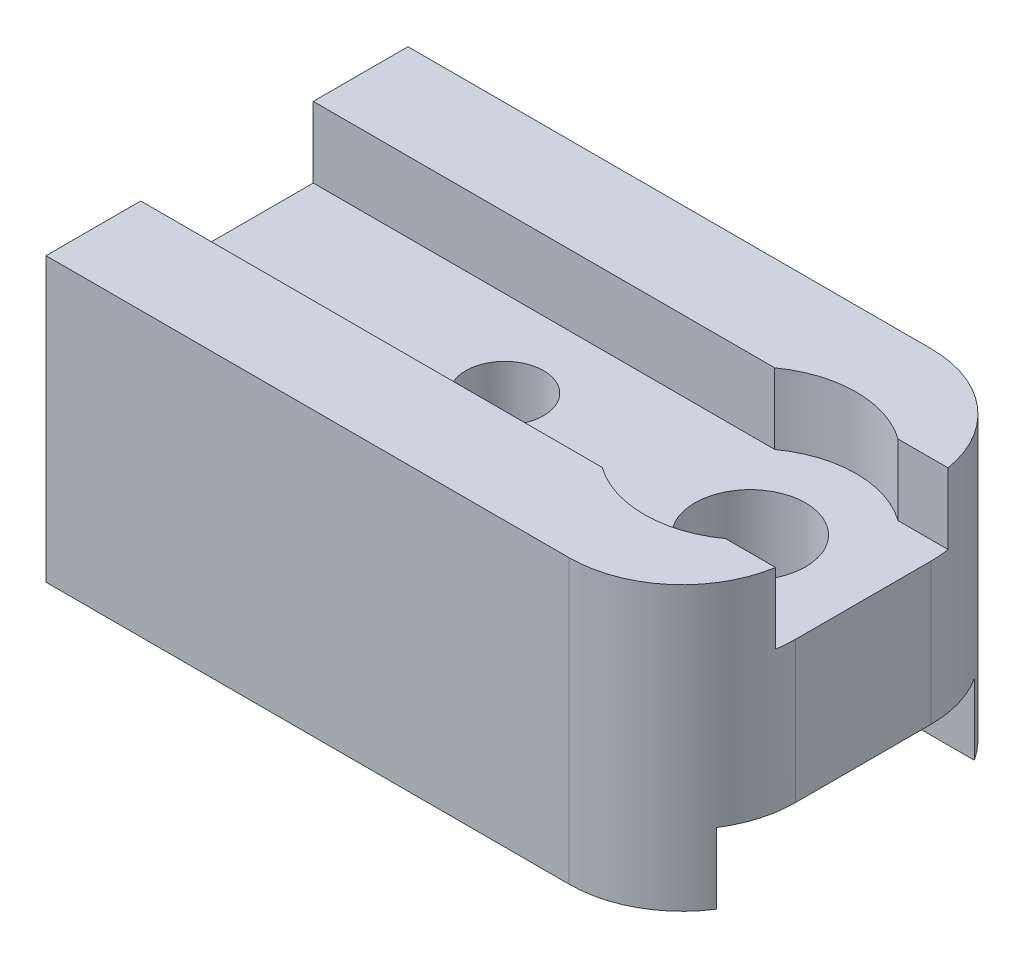
ISO-10303-21;
HEADER;
FILE_DESCRIPTION(('STEP AP214'),'2;1');
FILE_NAME('part.step','',(''),(''),'','','');
FILE_SCHEMA(('AUTOMOTIVE_DESIGN { 1 0 10303 214 1 1 1 1 }'));
ENDSEC;
DATA;
#1=APPLICATION_CONTEXT('core data for automotive mechanical design processes');
#2=APPLICATION_PROTOCOL_DEFINITION('international standard','automotive_design',2000,#1);
#3=PRODUCT_CONTEXT('',#1,'mechanical');
#4=PRODUCT('Part','Part','',(#3));
#5=PRODUCT_RELATED_PRODUCT_CATEGORY('part','',(#4));
#6=PRODUCT_DEFINITION_FORMATION('','',#4);
#7=PRODUCT_DEFINITION_CONTEXT('part definition',#1,'design');
#8=PRODUCT_DEFINITION('design','',#6,#7);
#9=PRODUCT_DEFINITION_SHAPE('','',#8);
#10=(LENGTH_UNIT() NAMED_UNIT(*) SI_UNIT(.MILLI.,.METRE.));
#11=(NAMED_UNIT(*) PLANE_ANGLE_UNIT() SI_UNIT($,.RADIAN.));
#12=(NAMED_UNIT(*) SI_UNIT($,.STERADIAN.) SOLID_ANGLE_UNIT());
#13=UNCERTAINTY_MEASURE_WITH_UNIT(LENGTH_MEASURE(1.E-05),#10,'distance_accuracy_value','');
#14=(GEOMETRIC_REPRESENTATION_CONTEXT(3) GLOBAL_UNCERTAINTY_ASSIGNED_CONTEXT((#13)) GLOBAL_UNIT_ASSIGNED_CONTEXT((#10,
#11,#12)) REPRESENTATION_CONTEXT('',''));
#15=CARTESIAN_POINT('',(0.,0.,0.));
#16=DIRECTION('',(0.,0.,1.));
#17=DIRECTION('',(1.,0.,0.));
#18=AXIS2_PLACEMENT_3D('',#15,#16,#17);
#19=CARTESIAN_POINT('',(-2.41594633531577,9.525,-12.0015));
#20=DIRECTION('',(0.,0.,-1.));
#21=DIRECTION('',(-1.,0.,0.));
#22=AXIS2_PLACEMENT_3D('',#19,#20,#21);
#23=PLANE('',#22);
#24=DIRECTION('',(0.,-1.,0.));
#25=VECTOR('',#24,1.);
#26=CARTESIAN_POINT('',(26.2658128771175,12.7,-12.0015));
#27=LINE('',#26,#25);
#28=CARTESIAN_POINT('',(26.2658128771175,9.525,-12.0015));
#29=VERTEX_POINT('',#28);
#30=CARTESIAN_POINT('',(26.2658128771175,12.7,-12.0015));
#31=VERTEX_POINT('',#30);
#32=EDGE_CURVE('E302',#29,#31,#27,.F.);
#33=ORIENTED_EDGE('',*,*,#32,.F.);
#34=DIRECTION('',(-1.,0.,0.));
#35=VECTOR('',#34,1.);
#36=CARTESIAN_POINT('',(-2.41594633531577,9.525,-12.0015));
#37=LINE('',#36,#35);
#38=CARTESIAN_POINT('',(28.5074794014539,9.525,-12.0015));
#39=VERTEX_POINT('',#38);
#40=EDGE_CURVE('E191',#39,#29,#37,.T.);
#41=ORIENTED_EDGE('',*,*,#40,.F.);
#42=DIRECTION('',(0.,-1.,0.));
#43=VECTOR('',#42,1.);
#44=CARTESIAN_POINT('',(28.5074794014539,9.525,-12.0015));
#45=LINE('',#44,#43);
#46=CARTESIAN_POINT('',(28.5074794014539,12.7,-12.0015));
#47=VERTEX_POINT('',#46);
#48=EDGE_CURVE('E264',#39,#47,#45,.F.);
#49=ORIENTED_EDGE('',*,*,#48,.T.);
#50=DIRECTION('',(-1.,0.,0.));
#51=VECTOR('',#50,1.);
#52=CARTESIAN_POINT('',(-2.41594633531577,12.7,-12.0015));
#53=LINE('',#52,#51);
#54=EDGE_CURVE('E193',#47,#31,#53,.T.);
#55=ORIENTED_EDGE('',*,*,#54,.T.);
#56=EDGE_LOOP('',(#33,#41,#49,#55));
#57=FACE_BOUND('',#56,.T.);
#58=ADVANCED_FACE('F36',(#57),#23,.F.);
#59=DIRECTION('',(0.,-1.,0.));
#60=VECTOR('',#59,1.);
#61=CARTESIAN_POINT('',(20.7241871228825,12.7,-12.0015));
#62=LINE('',#61,#60);
#63=CARTESIAN_POINT('',(20.7241871228825,12.7,-12.0015));
#64=VERTEX_POINT('',#63);
#65=CARTESIAN_POINT('',(20.7241871228825,9.525,-12.0015));
#66=VERTEX_POINT('',#65);
#67=EDGE_CURVE('E331',#64,#66,#62,.T.);
#68=ORIENTED_EDGE('',*,*,#67,.F.);
#69=CARTESIAN_POINT('',(0.,12.7,-12.0015));
#70=VERTEX_POINT('',#69);
#71=EDGE_CURVE('E185',#64,#70,#53,.T.);
#72=ORIENTED_EDGE('',*,*,#71,.T.);
#73=DIRECTION('',(0.,1.,0.));
#74=VECTOR('',#73,1.);
#75=CARTESIAN_POINT('',(0.,12.7,-12.0015));
#76=LINE('',#75,#74);
#77=CARTESIAN_POINT('',(0.,9.525,-12.0015));
#78=VERTEX_POINT('',#77);
#79=EDGE_CURVE('E208',#78,#70,#76,.T.);
#80=ORIENTED_EDGE('',*,*,#79,.F.);
#81=EDGE_CURVE('E303',#66,#78,#37,.T.);
#82=ORIENTED_EDGE('',*,*,#81,.F.);
#83=EDGE_LOOP('',(#68,#72,#80,#82));
#84=FACE_BOUND('',#83,.T.);
#85=ADVANCED_FACE('F340',(#84),#23,.F.);
#86=CARTESIAN_POINT('',(-2.41594633531577,9.525,-4.2545));
#87=DIRECTION('',(0.,0.,1.));
#88=DIRECTION('',(1.,0.,0.));
#89=AXIS2_PLACEMENT_3D('',#86,#87,#88);
#90=PLANE('',#89);
#91=DIRECTION('',(0.,-1.,0.));
#92=VECTOR('',#91,1.);
#93=CARTESIAN_POINT('',(20.7241871228825,12.7,-4.2545));
#94=LINE('',#93,#92);
#95=CARTESIAN_POINT('',(20.7241871228825,9.525,-4.2545));
#96=VERTEX_POINT('',#95);
#97=CARTESIAN_POINT('',(20.7241871228825,12.7,-4.2545));
#98=VERTEX_POINT('',#97);
#99=EDGE_CURVE('E165',#96,#98,#94,.F.);
#100=ORIENTED_EDGE('',*,*,#99,.F.);
#101=DIRECTION('',(1.,0.,0.));
#102=VECTOR('',#101,1.);
#103=CARTESIAN_POINT('',(-2.41594633531577,9.525,-4.2545));
#104=LINE('',#103,#102);
#105=CARTESIAN_POINT('',(0.,9.525,-4.2545));
#106=VERTEX_POINT('',#105);
#107=EDGE_CURVE('E304',#106,#96,#104,.T.);
#108=ORIENTED_EDGE('',*,*,#107,.F.);
#109=DIRECTION('',(0.,-1.,0.));
#110=VECTOR('',#109,1.);
#111=CARTESIAN_POINT('',(0.,12.7,-4.2545));
#112=LINE('',#111,#110);
#113=CARTESIAN_POINT('',(0.,12.7,-4.2545));
#114=VERTEX_POINT('',#113);
#115=EDGE_CURVE('E205',#114,#106,#112,.T.);
#116=ORIENTED_EDGE('',*,*,#115,.F.);
#117=DIRECTION('',(1.,0.,0.));
#118=VECTOR('',#117,1.);
#119=CARTESIAN_POINT('',(-2.41594633531577,12.7,-4.2545));
#120=LINE('',#119,#118);
#121=EDGE_CURVE('E182',#114,#98,#120,.T.);
#122=ORIENTED_EDGE('',*,*,#121,.T.);
#123=EDGE_LOOP('',(#100,#108,#116,#122));
#124=FACE_BOUND('',#123,.T.);
#125=ADVANCED_FACE('F347',(#124),#90,.F.);
#126=DIRECTION('',(0.,-1.,0.));
#127=VECTOR('',#126,1.);
#128=CARTESIAN_POINT('',(26.2658128771175,12.7,-4.2545));
#129=LINE('',#128,#127);
#130=CARTESIAN_POINT('',(26.2658128771175,12.7,-4.2545));
#131=VERTEX_POINT('',#130);
#132=CARTESIAN_POINT('',(26.2658128771175,9.525,-4.2545));
#133=VERTEX_POINT('',#132);
#134=EDGE_CURVE('E162',#131,#133,#129,.T.);
#135=ORIENTED_EDGE('',*,*,#134,.F.);
#136=CARTESIAN_POINT('',(28.5074794014539,12.7,-4.2545));
#137=VERTEX_POINT('',#136);
#138=EDGE_CURVE('E174',#131,#137,#120,.T.);
#139=ORIENTED_EDGE('',*,*,#138,.T.);
#140=DIRECTION('',(0.,-1.,0.));
#141=VECTOR('',#140,1.);
#142=CARTESIAN_POINT('',(28.5074794014539,12.7,-4.2545));
#143=LINE('',#142,#141);
#144=CARTESIAN_POINT('',(28.5074794014539,9.525,-4.2545));
#145=VERTEX_POINT('',#144);
#146=EDGE_CURVE('E11',#137,#145,#143,.T.);
#147=ORIENTED_EDGE('',*,*,#146,.T.);
#148=EDGE_CURVE('E176',#133,#145,#104,.T.);
#149=ORIENTED_EDGE('',*,*,#148,.F.);
#150=EDGE_LOOP('',(#135,#139,#147,#149));
#151=FACE_BOUND('',#150,.T.);
#152=ADVANCED_FACE('F173',(#151),#90,.F.);
#153=CARTESIAN_POINT('',(12.4714,12.7,-8.128));
#154=DIRECTION('',(0.,-1.,0.));
#155=DIRECTION('',(0.,0.,-1.));
#156=AXIS2_PLACEMENT_3D('',#153,#154,#155);
#157=CYLINDRICAL_SURFACE('',#156,1.75);
#158=CARTESIAN_POINT('',(12.4714,9.525,-8.128));
#159=DIRECTION('',(0.,1.,0.));
#160=DIRECTION('',(0.,0.,1.));
#161=AXIS2_PLACEMENT_3D('',#158,#159,#160);
#162=CIRCLE('',#161,1.75);
#163=CARTESIAN_POINT('',(12.4714,9.525,-6.378));
#164=VERTEX_POINT('',#163);
#165=EDGE_CURVE('E200',#164,#164,#162,.T.);
#166=ORIENTED_EDGE('',*,*,#165,.T.);
#167=EDGE_LOOP('',(#166));
#168=FACE_BOUND('',#167,.T.);
#169=CARTESIAN_POINT('',(12.4714,6.8072,-8.128));
#170=DIRECTION('',(0.,-1.,0.));
#171=DIRECTION('',(0.,0.,-1.));
#172=AXIS2_PLACEMENT_3D('',#169,#170,#171);
#173=CIRCLE('',#172,1.75);
#174=CARTESIAN_POINT('',(12.4714,6.8072,-9.878));
#175=VERTEX_POINT('',#174);
#176=EDGE_CURVE('E240',#175,#175,#173,.T.);
#177=ORIENTED_EDGE('',*,*,#176,.T.);
#178=EDGE_LOOP('',(#177));
#179=FACE_BOUND('',#178,.T.);
#180=ADVANCED_FACE('F393',(#168,#179),#157,.F.);
#181=CARTESIAN_POINT('',(23.495,12.7,-8.128));
#182=DIRECTION('',(0.,-1.,0.));
#183=DIRECTION('',(0.,0.,-1.));
#184=AXIS2_PLACEMENT_3D('',#181,#182,#183);
#185=CYLINDRICAL_SURFACE('',#184,2.4892);
#186=CARTESIAN_POINT('',(23.495,9.525,-8.128));
#187=DIRECTION('',(0.,1.,0.));
#188=DIRECTION('',(0.,0.,1.));
#189=AXIS2_PLACEMENT_3D('',#186,#187,#188);
#190=CIRCLE('',#189,2.4892);
#191=CARTESIAN_POINT('',(23.495,9.525,-5.6388));
#192=VERTEX_POINT('',#191);
#193=EDGE_CURVE('E196',#192,#192,#190,.T.);
#194=ORIENTED_EDGE('',*,*,#193,.T.);
#195=EDGE_LOOP('',(#194));
#196=FACE_BOUND('',#195,.T.);
#197=CARTESIAN_POINT('',(23.495,3.175,-8.128));
#198=DIRECTION('',(0.,-1.,0.));
#199=DIRECTION('',(0.,0.,-1.));
#200=AXIS2_PLACEMENT_3D('',#197,#198,#199);
#201=CIRCLE('',#200,2.4892);
#202=CARTESIAN_POINT('',(23.495,3.175,-10.6172));
#203=VERTEX_POINT('',#202);
#204=EDGE_CURVE('E311',#203,#203,#201,.T.);
#205=ORIENTED_EDGE('',*,*,#204,.T.);
#206=EDGE_LOOP('',(#205));
#207=FACE_BOUND('',#206,.T.);
#208=ADVANCED_FACE('F380',(#196,#207),#185,.F.);
#209=CARTESIAN_POINT('',(0.,0.,0.));
#210=DIRECTION('',(0.,-1.,0.));
#211=DIRECTION('',(0.,0.,-1.));
#212=AXIS2_PLACEMENT_3D('',#209,#210,#211);
#213=PLANE('',#212);
#214=DIRECTION('',(-1.,0.,0.));
#215=VECTOR('',#214,1.);
#216=CARTESIAN_POINT('',(-1.06671810131204,0.,-2.3368));
#217=LINE('',#216,#215);
#218=CARTESIAN_POINT('',(27.7706582838202,0.,-2.3368));
#219=VERTEX_POINT('',#218);
#220=CARTESIAN_POINT('',(0.,0.,-2.3368));
#221=VERTEX_POINT('',#220);
#222=EDGE_CURVE('E317',#219,#221,#217,.T.);
#223=ORIENTED_EDGE('',*,*,#222,.F.);
#224=CARTESIAN_POINT('',(23.495,0.,-5.08));
#225=DIRECTION('',(0.,-1.,0.));
#226=DIRECTION('',(0.,0.,-1.));
#227=AXIS2_PLACEMENT_3D('',#224,#225,#226);
#228=CIRCLE('',#227,5.08);
#229=CARTESIAN_POINT('',(23.495,0.,0.));
#230=VERTEX_POINT('',#229);
#231=EDGE_CURVE('E270',#219,#230,#228,.T.);
#232=ORIENTED_EDGE('',*,*,#231,.T.);
#233=DIRECTION('',(1.,0.,0.));
#234=VECTOR('',#233,1.);
#235=CARTESIAN_POINT('',(0.,0.,0.));
#236=LINE('',#235,#234);
#237=CARTESIAN_POINT('',(0.,0.,0.));
#238=VERTEX_POINT('',#237);
#239=EDGE_CURVE('E224',#238,#230,#236,.T.);
#240=ORIENTED_EDGE('',*,*,#239,.F.);
#241=DIRECTION('',(0.,0.,1.));
#242=VECTOR('',#241,1.);
#243=CARTESIAN_POINT('',(0.,0.,0.));
#244=LINE('',#243,#242);
#245=EDGE_CURVE('E211',#221,#238,#244,.T.);
#246=ORIENTED_EDGE('',*,*,#245,.F.);
#247=EDGE_LOOP('',(#223,#232,#240,#246));
#248=FACE_BOUND('',#247,.T.);
#249=ADVANCED_FACE('F352',(#248),#213,.T.);
#250=CARTESIAN_POINT('',(0.,12.7,0.));
#251=DIRECTION('',(0.,-1.,0.));
#252=DIRECTION('',(0.,0.,-1.));
#253=AXIS2_PLACEMENT_3D('',#250,#251,#252);
#254=PLANE('',#253);
#255=CARTESIAN_POINT('',(23.495,12.7,-8.128));
#256=DIRECTION('',(0.,1.,0.));
#257=DIRECTION('',(0.,0.,1.));
#258=AXIS2_PLACEMENT_3D('',#255,#256,#257);
#259=CIRCLE('',#258,4.7625);
#260=EDGE_CURVE('E170',#31,#64,#259,.T.);
#261=ORIENTED_EDGE('',*,*,#260,.F.);
#262=ORIENTED_EDGE('',*,*,#54,.F.);
#263=CARTESIAN_POINT('',(23.495,12.7,-11.176));
#264=DIRECTION('',(0.,-1.,0.));
#265=DIRECTION('',(0.,0.,-1.));
#266=AXIS2_PLACEMENT_3D('',#263,#264,#265);
#267=CIRCLE('',#266,5.08);
#268=CARTESIAN_POINT('',(23.495,12.7,-16.256));
#269=VERTEX_POINT('',#268);
#270=EDGE_CURVE('E266',#47,#269,#267,.F.);
#271=ORIENTED_EDGE('',*,*,#270,.T.);
#272=DIRECTION('',(-1.,0.,0.));
#273=VECTOR('',#272,1.);
#274=CARTESIAN_POINT('',(0.,12.7,-16.256));
#275=LINE('',#274,#273);
#276=CARTESIAN_POINT('',(0.,12.7,-16.256));
#277=VERTEX_POINT('',#276);
#278=EDGE_CURVE('E218',#269,#277,#275,.T.);
#279=ORIENTED_EDGE('',*,*,#278,.T.);
#280=DIRECTION('',(0.,0.,1.));
#281=VECTOR('',#280,1.);
#282=CARTESIAN_POINT('',(0.,12.7,0.));
#283=LINE('',#282,#281);
#284=EDGE_CURVE('E212',#277,#70,#283,.T.);
#285=ORIENTED_EDGE('',*,*,#284,.T.);
#286=ORIENTED_EDGE('',*,*,#71,.F.);
#287=EDGE_LOOP('',(#261,#262,#271,#279,#285,#286));
#288=FACE_BOUND('',#287,.T.);
#289=ADVANCED_FACE('F373',(#288),#254,.F.);
#290=EDGE_CURVE('E159',#98,#131,#259,.T.);
#291=ORIENTED_EDGE('',*,*,#290,.F.);
#292=ORIENTED_EDGE('',*,*,#121,.F.);
#293=CARTESIAN_POINT('',(0.,12.7,0.));
#294=VERTEX_POINT('',#293);
#295=EDGE_CURVE('E216',#114,#294,#283,.T.);
#296=ORIENTED_EDGE('',*,*,#295,.T.);
#297=DIRECTION('',(1.,0.,0.));
#298=VECTOR('',#297,1.);
#299=CARTESIAN_POINT('',(0.,12.7,0.));
#300=LINE('',#299,#298);
#301=CARTESIAN_POINT('',(23.495,12.7,0.));
#302=VERTEX_POINT('',#301);
#303=EDGE_CURVE('E215',#294,#302,#300,.T.);
#304=ORIENTED_EDGE('',*,*,#303,.T.);
#305=CARTESIAN_POINT('',(23.495,12.7,-5.08));
#306=DIRECTION('',(0.,-1.,0.));
#307=DIRECTION('',(0.,0.,-1.));
#308=AXIS2_PLACEMENT_3D('',#305,#306,#307);
#309=CIRCLE('',#308,5.08);
#310=EDGE_CURVE('E44',#302,#137,#309,.F.);
#311=ORIENTED_EDGE('',*,*,#310,.T.);
#312=ORIENTED_EDGE('',*,*,#138,.F.);
#313=EDGE_LOOP('',(#291,#292,#296,#304,#311,#312));
#314=FACE_BOUND('',#313,.T.);
#315=ADVANCED_FACE('F178',(#314),#254,.F.);
#316=DIRECTION('',(-1.,0.,0.));
#317=VECTOR('',#316,1.);
#318=CARTESIAN_POINT('',(0.,0.,-16.256));
#319=LINE('',#318,#317);
#320=CARTESIAN_POINT('',(23.495,0.,-16.256));
#321=VERTEX_POINT('',#320);
#322=CARTESIAN_POINT('',(0.,0.,-16.256));
#323=VERTEX_POINT('',#322);
#324=EDGE_CURVE('E227',#321,#323,#319,.T.);
#325=ORIENTED_EDGE('',*,*,#324,.F.);
#326=CARTESIAN_POINT('',(23.495,0.,-11.176));
#327=DIRECTION('',(0.,-1.,0.));
#328=DIRECTION('',(0.,0.,-1.));
#329=AXIS2_PLACEMENT_3D('',#326,#327,#328);
#330=CIRCLE('',#329,5.08);
#331=CARTESIAN_POINT('',(27.7706582838202,0.,-13.9192));
#332=VERTEX_POINT('',#331);
#333=EDGE_CURVE('E247',#321,#332,#330,.T.);
#334=ORIENTED_EDGE('',*,*,#333,.T.);
#335=DIRECTION('',(1.,0.,0.));
#336=VECTOR('',#335,1.);
#337=CARTESIAN_POINT('',(-1.06671810131204,0.,-13.9192));
#338=LINE('',#337,#336);
#339=CARTESIAN_POINT('',(0.,0.,-13.9192));
#340=VERTEX_POINT('',#339);
#341=EDGE_CURVE('E243',#340,#332,#338,.T.);
#342=ORIENTED_EDGE('',*,*,#341,.F.);
#343=EDGE_CURVE('E221',#323,#340,#244,.T.);
#344=ORIENTED_EDGE('',*,*,#343,.F.);
#345=EDGE_LOOP('',(#325,#334,#342,#344));
#346=FACE_BOUND('',#345,.T.);
#347=ADVANCED_FACE('F367',(#346),#213,.T.);
#348=CARTESIAN_POINT('',(0.,12.7,0.));
#349=DIRECTION('',(1.,0.,0.));
#350=DIRECTION('',(0.,0.,-1.));
#351=AXIS2_PLACEMENT_3D('',#348,#349,#350);
#352=PLANE('',#351);
#353=DIRECTION('',(0.,0.,-1.));
#354=VECTOR('',#353,1.);
#355=CARTESIAN_POINT('',(0.,3.175,0.));
#356=LINE('',#355,#354);
#357=CARTESIAN_POINT('',(0.,3.175,-2.3368));
#358=VERTEX_POINT('',#357);
#359=CARTESIAN_POINT('',(0.,3.175,-13.9192));
#360=VERTEX_POINT('',#359);
#361=EDGE_CURVE('E314',#358,#360,#356,.T.);
#362=ORIENTED_EDGE('',*,*,#361,.F.);
#363=DIRECTION('',(0.,-1.,0.));
#364=VECTOR('',#363,1.);
#365=CARTESIAN_POINT('',(0.,12.7,-2.3368));
#366=LINE('',#365,#364);
#367=EDGE_CURVE('E183',#358,#221,#366,.T.);
#368=ORIENTED_EDGE('',*,*,#367,.T.);
#369=ORIENTED_EDGE('',*,*,#245,.T.);
#370=DIRECTION('',(0.,-1.,0.));
#371=VECTOR('',#370,1.);
#372=CARTESIAN_POINT('',(0.,12.7,0.));
#373=LINE('',#372,#371);
#374=EDGE_CURVE('E231',#294,#238,#373,.T.);
#375=ORIENTED_EDGE('',*,*,#374,.F.);
#376=ORIENTED_EDGE('',*,*,#295,.F.);
#377=ORIENTED_EDGE('',*,*,#115,.T.);
#378=DIRECTION('',(0.,0.,1.));
#379=VECTOR('',#378,1.);
#380=CARTESIAN_POINT('',(0.,9.525,0.));
#381=LINE('',#380,#379);
#382=EDGE_CURVE('E203',#78,#106,#381,.T.);
#383=ORIENTED_EDGE('',*,*,#382,.F.);
#384=ORIENTED_EDGE('',*,*,#79,.T.);
#385=ORIENTED_EDGE('',*,*,#284,.F.);
#386=DIRECTION('',(0.,-1.,0.));
#387=VECTOR('',#386,1.);
#388=CARTESIAN_POINT('',(0.,12.7,-16.256));
#389=LINE('',#388,#387);
#390=EDGE_CURVE('E220',#277,#323,#389,.T.);
#391=ORIENTED_EDGE('',*,*,#390,.T.);
#392=ORIENTED_EDGE('',*,*,#343,.T.);
#393=DIRECTION('',(0.,1.,0.));
#394=VECTOR('',#393,1.);
#395=CARTESIAN_POINT('',(0.,12.7,-13.9192));
#396=LINE('',#395,#394);
#397=EDGE_CURVE('E187',#340,#360,#396,.T.);
#398=ORIENTED_EDGE('',*,*,#397,.T.);
#399=EDGE_LOOP('',(#362,#368,#369,#375,#376,#377,#383,#384,#385,#391,#392,#398));
#400=FACE_BOUND('',#399,.T.);
#401=ADVANCED_FACE('F345',(#400),#352,.F.);
#402=CARTESIAN_POINT('',(0.,12.7,0.));
#403=DIRECTION('',(0.,0.,-1.));
#404=DIRECTION('',(-1.,0.,0.));
#405=AXIS2_PLACEMENT_3D('',#402,#403,#404);
#406=PLANE('',#405);
#407=ORIENTED_EDGE('',*,*,#239,.T.);
#408=DIRECTION('',(0.,-1.,0.));
#409=VECTOR('',#408,1.);
#410=CARTESIAN_POINT('',(23.495,12.7,0.));
#411=LINE('',#410,#409);
#412=EDGE_CURVE('E272',#230,#302,#411,.F.);
#413=ORIENTED_EDGE('',*,*,#412,.T.);
#414=ORIENTED_EDGE('',*,*,#303,.F.);
#415=ORIENTED_EDGE('',*,*,#374,.T.);
#416=EDGE_LOOP('',(#407,#413,#414,#415));
#417=FACE_BOUND('',#416,.T.);
#418=ADVANCED_FACE('F276',(#417),#406,.F.);
#419=CARTESIAN_POINT('',(28.575,12.7,0.));
#420=DIRECTION('',(-1.,0.,0.));
#421=DIRECTION('',(0.,0.,1.));
#422=AXIS2_PLACEMENT_3D('',#419,#420,#421);
#423=PLANE('',#422);
#424=DIRECTION('',(0.,0.,1.));
#425=VECTOR('',#424,1.);
#426=CARTESIAN_POINT('',(28.575,3.175,0.));
#427=LINE('',#426,#425);
#428=CARTESIAN_POINT('',(28.575,3.175,-11.176));
#429=VERTEX_POINT('',#428);
#430=CARTESIAN_POINT('',(28.575,3.175,-5.08));
#431=VERTEX_POINT('',#430);
#432=EDGE_CURVE('E234',#429,#431,#427,.T.);
#433=ORIENTED_EDGE('',*,*,#432,.F.);
#434=DIRECTION('',(0.,-1.,0.));
#435=VECTOR('',#434,1.);
#436=CARTESIAN_POINT('',(28.575,12.7,-11.176));
#437=LINE('',#436,#435);
#438=CARTESIAN_POINT('',(28.575,9.525,-11.176));
#439=VERTEX_POINT('',#438);
#440=EDGE_CURVE('E258',#429,#439,#437,.F.);
#441=ORIENTED_EDGE('',*,*,#440,.T.);
#442=DIRECTION('',(0.,0.,-1.));
#443=VECTOR('',#442,1.);
#444=CARTESIAN_POINT('',(28.575,9.525,0.));
#445=LINE('',#444,#443);
#446=CARTESIAN_POINT('',(28.575,9.525,-5.08));
#447=VERTEX_POINT('',#446);
#448=EDGE_CURVE('E199',#447,#439,#445,.T.);
#449=ORIENTED_EDGE('',*,*,#448,.F.);
#450=DIRECTION('',(0.,-1.,0.));
#451=VECTOR('',#450,1.);
#452=CARTESIAN_POINT('',(28.575,12.7,-5.08));
#453=LINE('',#452,#451);
#454=EDGE_CURVE('E255',#447,#431,#453,.T.);
#455=ORIENTED_EDGE('',*,*,#454,.T.);
#456=EDGE_LOOP('',(#433,#441,#449,#455));
#457=FACE_BOUND('',#456,.T.);
#458=ADVANCED_FACE('F290',(#457),#423,.F.);
#459=CARTESIAN_POINT('',(0.,12.7,-16.256));
#460=DIRECTION('',(0.,0.,1.));
#461=DIRECTION('',(1.,0.,0.));
#462=AXIS2_PLACEMENT_3D('',#459,#460,#461);
#463=PLANE('',#462);
#464=ORIENTED_EDGE('',*,*,#278,.F.);
#465=DIRECTION('',(0.,-1.,0.));
#466=VECTOR('',#465,1.);
#467=CARTESIAN_POINT('',(23.495,12.7,-16.256));
#468=LINE('',#467,#466);
#469=EDGE_CURVE('E239',#269,#321,#468,.T.);
#470=ORIENTED_EDGE('',*,*,#469,.T.);
#471=ORIENTED_EDGE('',*,*,#324,.T.);
#472=ORIENTED_EDGE('',*,*,#390,.F.);
#473=EDGE_LOOP('',(#464,#470,#471,#472));
#474=FACE_BOUND('',#473,.T.);
#475=ADVANCED_FACE('F371',(#474),#463,.F.);
#476=CARTESIAN_POINT('',(0.,9.525,0.));
#477=DIRECTION('',(0.,1.,0.));
#478=DIRECTION('',(0.,0.,1.));
#479=AXIS2_PLACEMENT_3D('',#476,#477,#478);
#480=PLANE('',#479);
#481=ORIENTED_EDGE('',*,*,#40,.T.);
#482=CARTESIAN_POINT('',(23.495,9.525,-8.128));
#483=DIRECTION('',(0.,1.,0.));
#484=DIRECTION('',(0.,0.,1.));
#485=AXIS2_PLACEMENT_3D('',#482,#483,#484);
#486=CIRCLE('',#485,4.7625);
#487=EDGE_CURVE('E58',#29,#66,#486,.T.);
#488=ORIENTED_EDGE('',*,*,#487,.T.);
#489=ORIENTED_EDGE('',*,*,#81,.T.);
#490=ORIENTED_EDGE('',*,*,#382,.T.);
#491=ORIENTED_EDGE('',*,*,#107,.T.);
#492=EDGE_CURVE('E51',#96,#133,#486,.T.);
#493=ORIENTED_EDGE('',*,*,#492,.T.);
#494=ORIENTED_EDGE('',*,*,#148,.T.);
#495=CARTESIAN_POINT('',(23.495,9.525,-5.08));
#496=DIRECTION('',(0.,1.,0.));
#497=DIRECTION('',(0.,0.,1.));
#498=AXIS2_PLACEMENT_3D('',#495,#496,#497);
#499=CIRCLE('',#498,5.08);
#500=EDGE_CURVE('E260',#145,#447,#499,.T.);
#501=ORIENTED_EDGE('',*,*,#500,.T.);
#502=ORIENTED_EDGE('',*,*,#448,.T.);
#503=CARTESIAN_POINT('',(23.495,9.525,-11.176));
#504=DIRECTION('',(0.,1.,0.));
#505=DIRECTION('',(0.,0.,1.));
#506=AXIS2_PLACEMENT_3D('',#503,#504,#505);
#507=CIRCLE('',#506,5.08);
#508=EDGE_CURVE('E262',#439,#39,#507,.T.);
#509=ORIENTED_EDGE('',*,*,#508,.T.);
#510=EDGE_LOOP('',(#481,#488,#489,#490,#491,#493,#494,#501,#502,#509));
#511=FACE_BOUND('',#510,.T.);
#512=ORIENTED_EDGE('',*,*,#193,.F.);
#513=EDGE_LOOP('',(#512));
#514=FACE_BOUND('',#513,.T.);
#515=ORIENTED_EDGE('',*,*,#165,.F.);
#516=EDGE_LOOP('',(#515));
#517=FACE_BOUND('',#516,.T.);
#518=ADVANCED_FACE('F285',(#511,#514,#517),#480,.T.);
#519=CARTESIAN_POINT('',(-1.06671810131204,3.175,-2.3368));
#520=DIRECTION('',(0.,0.,1.));
#521=DIRECTION('',(1.,0.,0.));
#522=AXIS2_PLACEMENT_3D('',#519,#520,#521);
#523=PLANE('',#522);
#524=DIRECTION('',(-1.,0.,0.));
#525=VECTOR('',#524,1.);
#526=CARTESIAN_POINT('',(-1.06671810131204,3.175,-2.3368));
#527=LINE('',#526,#525);
#528=CARTESIAN_POINT('',(27.7706582838202,3.175,-2.3368));
#529=VERTEX_POINT('',#528);
#530=EDGE_CURVE('E316',#529,#358,#527,.T.);
#531=ORIENTED_EDGE('',*,*,#530,.F.);
#532=DIRECTION('',(0.,-1.,0.));
#533=VECTOR('',#532,1.);
#534=CARTESIAN_POINT('',(27.7706582838202,3.175,-2.3368));
#535=LINE('',#534,#533);
#536=EDGE_CURVE('E268',#529,#219,#535,.T.);
#537=ORIENTED_EDGE('',*,*,#536,.T.);
#538=ORIENTED_EDGE('',*,*,#222,.T.);
#539=ORIENTED_EDGE('',*,*,#367,.F.);
#540=EDGE_LOOP('',(#531,#537,#538,#539));
#541=FACE_BOUND('',#540,.T.);
#542=ADVANCED_FACE('F356',(#541),#523,.F.);
#543=CARTESIAN_POINT('',(-1.06671810131204,3.175,-13.9192));
#544=DIRECTION('',(0.,0.,-1.));
#545=DIRECTION('',(-1.,0.,0.));
#546=AXIS2_PLACEMENT_3D('',#543,#544,#545);
#547=PLANE('',#546);
#548=ORIENTED_EDGE('',*,*,#341,.T.);
#549=DIRECTION('',(0.,-1.,0.));
#550=VECTOR('',#549,1.);
#551=CARTESIAN_POINT('',(27.7706582838202,0.,-13.9192));
#552=LINE('',#551,#550);
#553=CARTESIAN_POINT('',(27.7706582838202,3.175,-13.9192));
#554=VERTEX_POINT('',#553);
#555=EDGE_CURVE('E249',#332,#554,#552,.F.);
#556=ORIENTED_EDGE('',*,*,#555,.T.);
#557=DIRECTION('',(1.,0.,0.));
#558=VECTOR('',#557,1.);
#559=CARTESIAN_POINT('',(-1.06671810131204,3.175,-13.9192));
#560=LINE('',#559,#558);
#561=EDGE_CURVE('E319',#360,#554,#560,.T.);
#562=ORIENTED_EDGE('',*,*,#561,.F.);
#563=ORIENTED_EDGE('',*,*,#397,.F.);
#564=EDGE_LOOP('',(#548,#556,#562,#563));
#565=FACE_BOUND('',#564,.T.);
#566=ADVANCED_FACE('F361',(#565),#547,.F.);
#567=CARTESIAN_POINT('',(0.,3.175,0.));
#568=DIRECTION('',(0.,-1.,0.));
#569=DIRECTION('',(0.,0.,-1.));
#570=AXIS2_PLACEMENT_3D('',#567,#568,#569);
#571=PLANE('',#570);
#572=CARTESIAN_POINT('',(12.4714,3.175,-8.128));
#573=DIRECTION('',(0.,-1.,0.));
#574=DIRECTION('',(0.,0.,-1.));
#575=AXIS2_PLACEMENT_3D('',#572,#573,#574);
#576=CIRCLE('',#575,3.7465);
#577=CARTESIAN_POINT('',(12.4714,3.175,-11.8745));
#578=VERTEX_POINT('',#577);
#579=EDGE_CURVE('E325',#578,#578,#576,.T.);
#580=ORIENTED_EDGE('',*,*,#579,.F.);
#581=EDGE_LOOP('',(#580));
#582=FACE_BOUND('',#581,.T.);
#583=ORIENTED_EDGE('',*,*,#204,.F.);
#584=EDGE_LOOP('',(#583));
#585=FACE_BOUND('',#584,.T.);
#586=ORIENTED_EDGE('',*,*,#561,.T.);
#587=CARTESIAN_POINT('',(23.495,3.175,-11.176));
#588=DIRECTION('',(0.,-1.,0.));
#589=DIRECTION('',(0.,0.,-1.));
#590=AXIS2_PLACEMENT_3D('',#587,#588,#589);
#591=CIRCLE('',#590,5.08);
#592=EDGE_CURVE('E253',#554,#429,#591,.T.);
#593=ORIENTED_EDGE('',*,*,#592,.T.);
#594=ORIENTED_EDGE('',*,*,#432,.T.);
#595=CARTESIAN_POINT('',(23.495,3.175,-5.08));
#596=DIRECTION('',(0.,-1.,0.));
#597=DIRECTION('',(0.,0.,-1.));
#598=AXIS2_PLACEMENT_3D('',#595,#596,#597);
#599=CIRCLE('',#598,5.08);
#600=EDGE_CURVE('E251',#431,#529,#599,.T.);
#601=ORIENTED_EDGE('',*,*,#600,.T.);
#602=ORIENTED_EDGE('',*,*,#530,.T.);
#603=ORIENTED_EDGE('',*,*,#361,.T.);
#604=EDGE_LOOP('',(#586,#593,#594,#601,#602,#603));
#605=FACE_BOUND('',#604,.T.);
#606=ADVANCED_FACE('F358',(#582,#585,#605),#571,.T.);
#607=CARTESIAN_POINT('',(12.4714,6.8072,-8.128));
#608=DIRECTION('',(0.,-1.,0.));
#609=DIRECTION('',(0.,0.,-1.));
#610=AXIS2_PLACEMENT_3D('',#607,#608,#609);
#611=CYLINDRICAL_SURFACE('',#610,3.7465);
#612=CARTESIAN_POINT('',(12.4714,6.8072,-8.128));
#613=DIRECTION('',(0.,-1.,0.));
#614=DIRECTION('',(0.,0.,-1.));
#615=AXIS2_PLACEMENT_3D('',#612,#613,#614);
#616=CIRCLE('',#615,3.7465);
#617=CARTESIAN_POINT('',(12.4714,6.8072,-11.8745));
#618=VERTEX_POINT('',#617);
#619=EDGE_CURVE('E244',#618,#618,#616,.T.);
#620=ORIENTED_EDGE('',*,*,#619,.F.);
#621=EDGE_LOOP('',(#620));
#622=FACE_BOUND('',#621,.T.);
#623=ORIENTED_EDGE('',*,*,#579,.T.);
#624=EDGE_LOOP('',(#623));
#625=FACE_BOUND('',#624,.T.);
#626=ADVANCED_FACE('F405',(#622,#625),#611,.F.);
#627=CARTESIAN_POINT('',(12.4714,6.8072,-8.128));
#628=DIRECTION('',(0.,-1.,0.));
#629=DIRECTION('',(0.,0.,-1.));
#630=AXIS2_PLACEMENT_3D('',#627,#628,#629);
#631=PLANE('',#630);
#632=ORIENTED_EDGE('',*,*,#176,.F.);
#633=EDGE_LOOP('',(#632));
#634=FACE_BOUND('',#633,.T.);
#635=ORIENTED_EDGE('',*,*,#619,.T.);
#636=EDGE_LOOP('',(#635));
#637=FACE_BOUND('',#636,.T.);
#638=ADVANCED_FACE('F412',(#634,#637),#631,.T.);
#639=CARTESIAN_POINT('',(23.495,12.7,-11.176));
#640=DIRECTION('',(0.,-1.,0.));
#641=DIRECTION('',(0.,0.,-1.));
#642=AXIS2_PLACEMENT_3D('',#639,#640,#641);
#643=CYLINDRICAL_SURFACE('',#642,5.08);
#644=ORIENTED_EDGE('',*,*,#508,.F.);
#645=ORIENTED_EDGE('',*,*,#440,.F.);
#646=ORIENTED_EDGE('',*,*,#592,.F.);
#647=ORIENTED_EDGE('',*,*,#555,.F.);
#648=ORIENTED_EDGE('',*,*,#333,.F.);
#649=ORIENTED_EDGE('',*,*,#469,.F.);
#650=ORIENTED_EDGE('',*,*,#270,.F.);
#651=ORIENTED_EDGE('',*,*,#48,.F.);
#652=EDGE_LOOP('',(#644,#645,#646,#647,#648,#649,#650,#651));
#653=FACE_BOUND('',#652,.T.);
#654=ADVANCED_FACE('F294',(#653),#643,.T.);
#655=CARTESIAN_POINT('',(23.495,12.7,-5.08));
#656=DIRECTION('',(0.,-1.,0.));
#657=DIRECTION('',(0.,0.,-1.));
#658=AXIS2_PLACEMENT_3D('',#655,#656,#657);
#659=CYLINDRICAL_SURFACE('',#658,5.08);
#660=ORIENTED_EDGE('',*,*,#310,.F.);
#661=ORIENTED_EDGE('',*,*,#412,.F.);
#662=ORIENTED_EDGE('',*,*,#231,.F.);
#663=ORIENTED_EDGE('',*,*,#536,.F.);
#664=ORIENTED_EDGE('',*,*,#600,.F.);
#665=ORIENTED_EDGE('',*,*,#454,.F.);
#666=ORIENTED_EDGE('',*,*,#500,.F.);
#667=ORIENTED_EDGE('',*,*,#146,.F.);
#668=EDGE_LOOP('',(#660,#661,#662,#663,#664,#665,#666,#667));
#669=FACE_BOUND('',#668,.T.);
#670=ADVANCED_FACE('F38',(#669),#659,.T.);
#671=CARTESIAN_POINT('',(23.495,12.7,-8.128));
#672=DIRECTION('',(0.,-1.,0.));
#673=DIRECTION('',(0.,0.,-1.));
#674=AXIS2_PLACEMENT_3D('',#671,#672,#673);
#675=CYLINDRICAL_SURFACE('',#674,4.7625);
#676=ORIENTED_EDGE('',*,*,#99,.T.);
#677=ORIENTED_EDGE('',*,*,#290,.T.);
#678=ORIENTED_EDGE('',*,*,#134,.T.);
#679=ORIENTED_EDGE('',*,*,#492,.F.);
#680=EDGE_LOOP('',(#676,#677,#678,#679));
#681=FACE_BOUND('',#680,.T.);
#682=ADVANCED_FACE('F161',(#681),#675,.F.);
#683=ORIENTED_EDGE('',*,*,#32,.T.);
#684=ORIENTED_EDGE('',*,*,#260,.T.);
#685=ORIENTED_EDGE('',*,*,#67,.T.);
#686=ORIENTED_EDGE('',*,*,#487,.F.);
#687=EDGE_LOOP('',(#683,#684,#685,#686));
#688=FACE_BOUND('',#687,.T.);
#689=ADVANCED_FACE('F336',(#688),#675,.F.);
#690=CLOSED_SHELL('',(#58,#85,#125,#152,#180,#208,#249,#289,#315,#347,#401,#418,#458,#475,#518,
#542,#566,#606,#626,#638,#654,#670,#682,#689));
#691=MANIFOLD_SOLID_BREP('B2',#690);
#692=ADVANCED_BREP_SHAPE_REPRESENTATION('',(#18,#691),#14);
#693=SHAPE_DEFINITION_REPRESENTATION(#9,#692);
ENDSEC;
END-ISO-10303-21;
